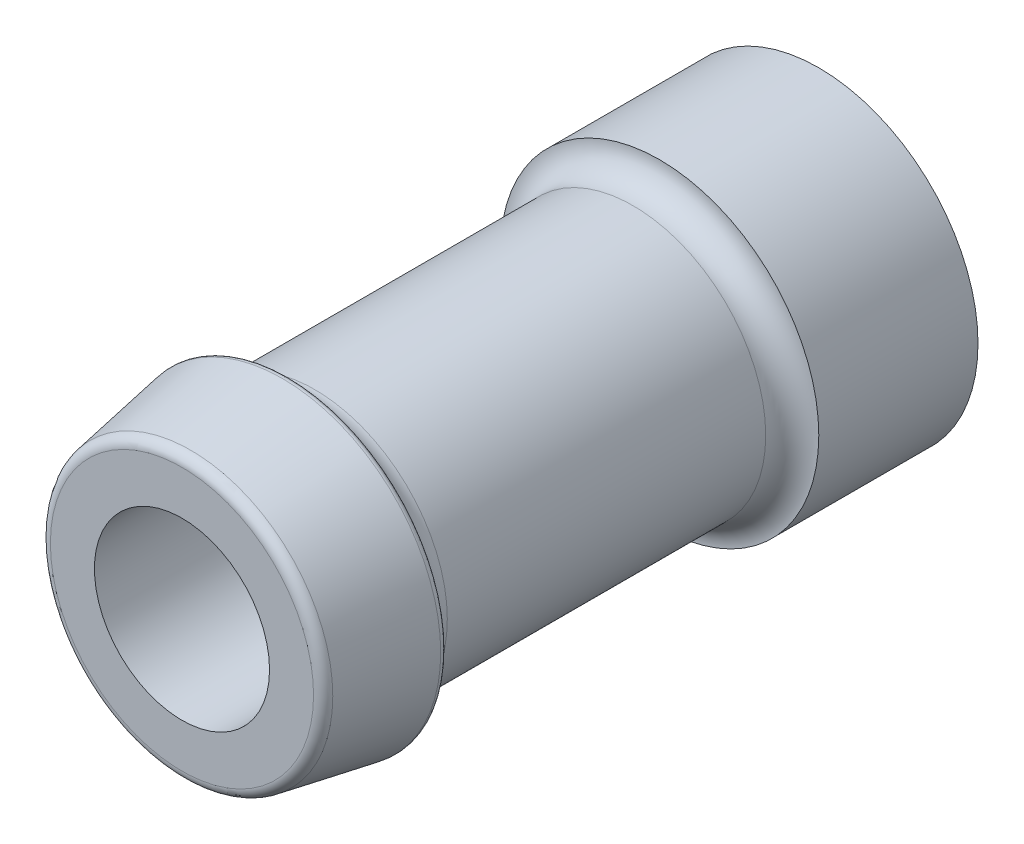
ISO-10303-21;
HEADER;
FILE_DESCRIPTION(('STEP AP214'),'2;1');
FILE_NAME('part.step','',(''),(''),'','','');
FILE_SCHEMA(('AUTOMOTIVE_DESIGN { 1 0 10303 214 1 1 1 1 }'));
ENDSEC;
DATA;
#1=APPLICATION_CONTEXT('core data for automotive mechanical design processes');
#2=APPLICATION_PROTOCOL_DEFINITION('international standard','automotive_design',2000,#1);
#3=PRODUCT_CONTEXT('',#1,'mechanical');
#4=PRODUCT('Part','Part','',(#3));
#5=PRODUCT_RELATED_PRODUCT_CATEGORY('part','',(#4));
#6=PRODUCT_DEFINITION_FORMATION('','',#4);
#7=PRODUCT_DEFINITION_CONTEXT('part definition',#1,'design');
#8=PRODUCT_DEFINITION('design','',#6,#7);
#9=PRODUCT_DEFINITION_SHAPE('','',#8);
#10=(LENGTH_UNIT() NAMED_UNIT(*) SI_UNIT(.MILLI.,.METRE.));
#11=(NAMED_UNIT(*) PLANE_ANGLE_UNIT() SI_UNIT($,.RADIAN.));
#12=(NAMED_UNIT(*) SI_UNIT($,.STERADIAN.) SOLID_ANGLE_UNIT());
#13=UNCERTAINTY_MEASURE_WITH_UNIT(LENGTH_MEASURE(1.E-05),#10,'distance_accuracy_value','');
#14=(GEOMETRIC_REPRESENTATION_CONTEXT(3) GLOBAL_UNCERTAINTY_ASSIGNED_CONTEXT((#13)) GLOBAL_UNIT_ASSIGNED_CONTEXT((#10,
#11,#12)) REPRESENTATION_CONTEXT('',''));
#15=CARTESIAN_POINT('',(0.,0.,0.));
#16=DIRECTION('',(0.,0.,1.));
#17=DIRECTION('',(1.,0.,0.));
#18=AXIS2_PLACEMENT_3D('',#15,#16,#17);
#19=CARTESIAN_POINT('',(0.,0.,30.48));
#20=DIRECTION('',(0.,0.,-1.));
#21=DIRECTION('',(-1.,0.,0.));
#22=AXIS2_PLACEMENT_3D('',#19,#20,#21);
#23=CYLINDRICAL_SURFACE('',#22,7.62);
#24=CARTESIAN_POINT('',(0.,0.,0.));
#25=DIRECTION('',(0.,0.,1.));
#26=DIRECTION('',(1.,0.,0.));
#27=AXIS2_PLACEMENT_3D('',#24,#25,#26);
#28=CIRCLE('',#27,7.62);
#29=CARTESIAN_POINT('',(-7.62,0.,0.));
#30=VERTEX_POINT('',#29);
#31=EDGE_CURVE('E71',#30,#30,#28,.T.);
#32=CARTESIAN_POINT('',(0.,0.,7.62));
#33=DIRECTION('',(0.,0.,1.));
#34=DIRECTION('',(1.,0.,0.));
#35=AXIS2_PLACEMENT_3D('',#32,#33,#34);
#36=CIRCLE('',#35,7.62);
#37=CARTESIAN_POINT('',(-7.62,0.,7.61999999999999));
#38=VERTEX_POINT('',#37);
#39=EDGE_CURVE('E72',#38,#38,#36,.T.);
#40=CARTESIAN_POINT('',(-7.62,0.,0.));
#41=CARTESIAN_POINT('',(-7.62,0.,0.0793749999999997));
#42=CARTESIAN_POINT('',(-7.62,0.,0.158749999999999));
#43=CARTESIAN_POINT('',(-7.62,0.,0.3175));
#44=CARTESIAN_POINT('',(-7.62,0.,0.396875));
#45=CARTESIAN_POINT('',(-7.62,0.,0.555625000000001));
#46=CARTESIAN_POINT('',(-7.62,0.,0.635));
#47=CARTESIAN_POINT('',(-7.62,0.,0.793749999999999));
#48=CARTESIAN_POINT('',(-7.62,0.,0.873124999999999));
#49=CARTESIAN_POINT('',(-7.62,0.,1.031875));
#50=CARTESIAN_POINT('',(-7.62,0.,1.11125));
#51=CARTESIAN_POINT('',(-7.62,0.,1.27));
#52=CARTESIAN_POINT('',(-7.62,0.,1.349375));
#53=CARTESIAN_POINT('',(-7.62,0.,1.508125));
#54=CARTESIAN_POINT('',(-7.62,0.,1.5875));
#55=CARTESIAN_POINT('',(-7.62,0.,1.74625));
#56=CARTESIAN_POINT('',(-7.62,0.,1.825625));
#57=CARTESIAN_POINT('',(-7.62,0.,1.984375));
#58=CARTESIAN_POINT('',(-7.62,0.,2.06375));
#59=CARTESIAN_POINT('',(-7.62,0.,2.2225));
#60=CARTESIAN_POINT('',(-7.62,0.,2.301875));
#61=CARTESIAN_POINT('',(-7.62,0.,2.460625));
#62=CARTESIAN_POINT('',(-7.62,0.,2.54));
#63=CARTESIAN_POINT('',(-7.62,0.,2.69875));
#64=CARTESIAN_POINT('',(-7.62,0.,2.778125));
#65=CARTESIAN_POINT('',(-7.62,0.,2.936875));
#66=CARTESIAN_POINT('',(-7.62,0.,3.01625));
#67=CARTESIAN_POINT('',(-7.62,0.,3.175));
#68=CARTESIAN_POINT('',(-7.62,0.,3.254375));
#69=CARTESIAN_POINT('',(-7.62,0.,3.413125));
#70=CARTESIAN_POINT('',(-7.62,0.,3.4925));
#71=CARTESIAN_POINT('',(-7.62,0.,3.65125));
#72=CARTESIAN_POINT('',(-7.62,0.,3.730625));
#73=CARTESIAN_POINT('',(-7.62,0.,3.889375));
#74=CARTESIAN_POINT('',(-7.62,0.,3.96875));
#75=CARTESIAN_POINT('',(-7.62,0.,4.1275));
#76=CARTESIAN_POINT('',(-7.62,0.,4.206875));
#77=CARTESIAN_POINT('',(-7.62,0.,4.365625));
#78=CARTESIAN_POINT('',(-7.62,0.,4.445));
#79=CARTESIAN_POINT('',(-7.62,0.,4.60375));
#80=CARTESIAN_POINT('',(-7.62,0.,4.683125));
#81=CARTESIAN_POINT('',(-7.62,0.,4.841875));
#82=CARTESIAN_POINT('',(-7.62,0.,4.92125));
#83=CARTESIAN_POINT('',(-7.62,0.,5.07999999999999));
#84=CARTESIAN_POINT('',(-7.62,0.,5.159375));
#85=CARTESIAN_POINT('',(-7.62,0.,5.318125));
#86=CARTESIAN_POINT('',(-7.62,0.,5.3975));
#87=CARTESIAN_POINT('',(-7.62,0.,5.55625));
#88=CARTESIAN_POINT('',(-7.62,0.,5.635625));
#89=CARTESIAN_POINT('',(-7.62,0.,5.794375));
#90=CARTESIAN_POINT('',(-7.62,0.,5.87375));
#91=CARTESIAN_POINT('',(-7.62,0.,6.0325));
#92=CARTESIAN_POINT('',(-7.62,0.,6.111875));
#93=CARTESIAN_POINT('',(-7.62,0.,6.27062499999999));
#94=CARTESIAN_POINT('',(-7.62,0.,6.34999999999999));
#95=CARTESIAN_POINT('',(-7.62,0.,6.50874999999999));
#96=CARTESIAN_POINT('',(-7.62,0.,6.588125));
#97=CARTESIAN_POINT('',(-7.62,0.,6.746875));
#98=CARTESIAN_POINT('',(-7.62,0.,6.82625));
#99=CARTESIAN_POINT('',(-7.62,0.,6.985));
#100=CARTESIAN_POINT('',(-7.62,0.,7.064375));
#101=CARTESIAN_POINT('',(-7.62,0.,7.223125));
#102=CARTESIAN_POINT('',(-7.62,0.,7.3025));
#103=CARTESIAN_POINT('',(-7.62,0.,7.46125));
#104=CARTESIAN_POINT('',(-7.62,0.,7.540625));
#105=CARTESIAN_POINT('',(-7.62,0.,7.61999999999999));
#106=B_SPLINE_CURVE_WITH_KNOTS('',3,(#40,#41,#42,#43,#44,#45,#46,#47,#48,#49,#50,#51,#52,#53,
#54,#55,#56,#57,#58,#59,#60,#61,#62,#63,#64,#65,#66,#67,#68,#69,#70,#71,#72,#73,#74,#75,#76,#77,
#78,#79,#80,#81,#82,#83,#84,#85,#86,#87,#88,#89,#90,#91,#92,#93,#94,#95,#96,#97,#98,#99,#100,
#101,#102,#103,#104,#105),.UNSPECIFIED.,.F.,.F.,(4,2,2,2,2,2,2,2,2,2,2,2,2,2,2,2,2,2,2,2,2,2,2,
2,2,2,2,2,2,2,2,2,4),(0.,0.238124999999999,0.476250000000001,0.714375,0.952499999999998,
1.190625,1.42875,1.666875,1.905,2.143125,2.38125,2.619375,2.8575,3.095625,3.33375,3.571875,3.81,
4.048125,4.28625,4.524375,4.7625,5.00062499999999,5.23875,5.476875,5.715,5.953125,6.19125,
6.42937499999999,6.6675,6.905625,7.14375,7.381875,7.61999999999999),.UNSPECIFIED.);
#107=EDGE_CURVE('BSEAM39',#30,#38,#106,.T.);
#108=ORIENTED_EDGE('',*,*,#31,.T.);
#109=ORIENTED_EDGE('',*,*,#39,.F.);
#110=ORIENTED_EDGE('',*,*,#107,.T.);
#111=ORIENTED_EDGE('',*,*,#107,.F.);
#112=EDGE_LOOP('',(#108,#110,#109,#111));
#113=FACE_BOUND('',#112,.T.);
#114=ADVANCED_FACE('F39',(#113),#23,.T.);
#115=CARTESIAN_POINT('',(0.,0.,30.48));
#116=DIRECTION('',(0.,0.,1.));
#117=DIRECTION('',(1.,0.,0.));
#118=AXIS2_PLACEMENT_3D('',#115,#116,#117);
#119=PLANE('',#118);
#120=CARTESIAN_POINT('',(0.,0.,30.48));
#121=DIRECTION('',(0.,0.,1.));
#122=DIRECTION('',(1.,0.,0.));
#123=AXIS2_PLACEMENT_3D('',#120,#121,#122);
#124=CIRCLE('',#123,6.29799632536296);
#125=CARTESIAN_POINT('',(6.29799632536296,0.,30.48));
#126=VERTEX_POINT('',#125);
#127=EDGE_CURVE('E57',#126,#126,#124,.T.);
#128=ORIENTED_EDGE('',*,*,#127,.T.);
#129=EDGE_LOOP('',(#128));
#130=FACE_BOUND('',#129,.T.);
#131=CARTESIAN_POINT('',(0.,0.,30.48));
#132=DIRECTION('',(0.,0.,1.));
#133=DIRECTION('',(1.,0.,0.));
#134=AXIS2_PLACEMENT_3D('',#131,#132,#133);
#135=CIRCLE('',#134,4.191);
#136=CARTESIAN_POINT('',(4.191,0.,30.48));
#137=VERTEX_POINT('',#136);
#138=EDGE_CURVE('E76',#137,#137,#135,.T.);
#139=ORIENTED_EDGE('',*,*,#138,.F.);
#140=EDGE_LOOP('',(#139));
#141=FACE_BOUND('',#140,.T.);
#142=ADVANCED_FACE('F98',(#130,#141),#119,.T.);
#143=CARTESIAN_POINT('',(0.,0.,0.));
#144=DIRECTION('',(0.,0.,1.));
#145=DIRECTION('',(1.,0.,0.));
#146=AXIS2_PLACEMENT_3D('',#143,#144,#145);
#147=PLANE('',#146);
#148=CARTESIAN_POINT('',(0.,0.,0.));
#149=DIRECTION('',(0.,0.,1.));
#150=DIRECTION('',(1.,0.,0.));
#151=AXIS2_PLACEMENT_3D('',#148,#149,#150);
#152=CIRCLE('',#151,4.191);
#153=CARTESIAN_POINT('',(4.191,0.,0.));
#154=VERTEX_POINT('',#153);
#155=EDGE_CURVE('E80',#154,#154,#152,.T.);
#156=ORIENTED_EDGE('',*,*,#155,.T.);
#157=EDGE_LOOP('',(#156));
#158=FACE_BOUND('',#157,.T.);
#159=ORIENTED_EDGE('',*,*,#31,.F.);
#160=EDGE_LOOP('',(#159));
#161=FACE_BOUND('',#160,.T.);
#162=ADVANCED_FACE('F88',(#158,#161),#147,.F.);
#163=CARTESIAN_POINT('',(0.,0.,0.));
#164=DIRECTION('',(0.,0.,1.));
#165=DIRECTION('',(1.,0.,0.));
#166=AXIS2_PLACEMENT_3D('',#163,#164,#165);
#167=CYLINDRICAL_SURFACE('',#166,4.191);
#168=CARTESIAN_POINT('',(4.191,0.,0.));
#169=CARTESIAN_POINT('',(4.191,0.,0.317499999999999));
#170=CARTESIAN_POINT('',(4.191,0.,0.635));
#171=CARTESIAN_POINT('',(4.191,0.,1.27));
#172=CARTESIAN_POINT('',(4.191,0.,1.5875));
#173=CARTESIAN_POINT('',(4.191,0.,2.2225));
#174=CARTESIAN_POINT('',(4.191,0.,2.54));
#175=CARTESIAN_POINT('',(4.191,0.,3.175));
#176=CARTESIAN_POINT('',(4.191,0.,3.4925));
#177=CARTESIAN_POINT('',(4.191,0.,4.1275));
#178=CARTESIAN_POINT('',(4.191,0.,4.445));
#179=CARTESIAN_POINT('',(4.191,0.,5.08));
#180=CARTESIAN_POINT('',(4.191,0.,5.3975));
#181=CARTESIAN_POINT('',(4.191,0.,6.0325));
#182=CARTESIAN_POINT('',(4.191,0.,6.35));
#183=CARTESIAN_POINT('',(4.191,0.,6.985));
#184=CARTESIAN_POINT('',(4.191,0.,7.3025));
#185=CARTESIAN_POINT('',(4.191,0.,7.9375));
#186=CARTESIAN_POINT('',(4.191,0.,8.255));
#187=CARTESIAN_POINT('',(4.191,0.,8.89));
#188=CARTESIAN_POINT('',(4.191,0.,9.2075));
#189=CARTESIAN_POINT('',(4.191,0.,9.8425));
#190=CARTESIAN_POINT('',(4.191,0.,10.16));
#191=CARTESIAN_POINT('',(4.191,0.,10.795));
#192=CARTESIAN_POINT('',(4.191,0.,11.1125));
#193=CARTESIAN_POINT('',(4.191,0.,11.7475));
#194=CARTESIAN_POINT('',(4.191,0.,12.065));
#195=CARTESIAN_POINT('',(4.191,0.,12.7));
#196=CARTESIAN_POINT('',(4.191,0.,13.0175));
#197=CARTESIAN_POINT('',(4.191,0.,13.6525));
#198=CARTESIAN_POINT('',(4.191,0.,13.97));
#199=CARTESIAN_POINT('',(4.191,0.,14.605));
#200=CARTESIAN_POINT('',(4.191,0.,14.9225));
#201=CARTESIAN_POINT('',(4.191,0.,15.5575));
#202=CARTESIAN_POINT('',(4.191,0.,15.875));
#203=CARTESIAN_POINT('',(4.191,0.,16.51));
#204=CARTESIAN_POINT('',(4.191,0.,16.8275));
#205=CARTESIAN_POINT('',(4.191,0.,17.4625));
#206=CARTESIAN_POINT('',(4.191,0.,17.78));
#207=CARTESIAN_POINT('',(4.191,0.,18.415));
#208=CARTESIAN_POINT('',(4.191,0.,18.7325));
#209=CARTESIAN_POINT('',(4.191,0.,19.3675));
#210=CARTESIAN_POINT('',(4.191,0.,19.685));
#211=CARTESIAN_POINT('',(4.191,0.,20.32));
#212=CARTESIAN_POINT('',(4.191,0.,20.6375));
#213=CARTESIAN_POINT('',(4.191,0.,21.2725));
#214=CARTESIAN_POINT('',(4.191,0.,21.59));
#215=CARTESIAN_POINT('',(4.191,0.,22.225));
#216=CARTESIAN_POINT('',(4.191,0.,22.5425));
#217=CARTESIAN_POINT('',(4.191,0.,23.1775));
#218=CARTESIAN_POINT('',(4.191,0.,23.495));
#219=CARTESIAN_POINT('',(4.191,0.,24.13));
#220=CARTESIAN_POINT('',(4.191,0.,24.4475));
#221=CARTESIAN_POINT('',(4.191,0.,25.0825));
#222=CARTESIAN_POINT('',(4.191,0.,25.4));
#223=CARTESIAN_POINT('',(4.191,0.,26.035));
#224=CARTESIAN_POINT('',(4.191,0.,26.3525));
#225=CARTESIAN_POINT('',(4.191,0.,26.9875));
#226=CARTESIAN_POINT('',(4.191,0.,27.305));
#227=CARTESIAN_POINT('',(4.191,0.,27.94));
#228=CARTESIAN_POINT('',(4.191,0.,28.2575));
#229=CARTESIAN_POINT('',(4.191,0.,28.8925));
#230=CARTESIAN_POINT('',(4.191,0.,29.21));
#231=CARTESIAN_POINT('',(4.191,0.,29.845));
#232=CARTESIAN_POINT('',(4.191,0.,30.1625));
#233=CARTESIAN_POINT('',(4.191,0.,30.48));
#234=B_SPLINE_CURVE_WITH_KNOTS('',3,(#168,#169,#170,#171,#172,#173,#174,#175,#176,#177,#178,
#179,#180,#181,#182,#183,#184,#185,#186,#187,#188,#189,#190,#191,#192,#193,#194,#195,#196,#197,
#198,#199,#200,#201,#202,#203,#204,#205,#206,#207,#208,#209,#210,#211,#212,#213,#214,#215,#216,
#217,#218,#219,#220,#221,#222,#223,#224,#225,#226,#227,#228,#229,#230,#231,#232,#233),
.UNSPECIFIED.,.F.,.F.,(4,2,2,2,2,2,2,2,2,2,2,2,2,2,2,2,2,2,2,2,2,2,2,2,2,2,2,2,2,2,2,2,4),(0.,
0.9525,1.905,2.8575,3.81,4.7625,5.715,6.6675,7.62,8.5725,9.525,10.4775,11.43,12.3825,13.335,
14.2875,15.24,16.1925,17.145,18.0975,19.05,20.0025,20.955,21.9075,22.86,23.8125,24.765,25.7175,
26.67,27.6225,28.575,29.5275,30.48),.UNSPECIFIED.);
#235=EDGE_CURVE('BSEAM91',#154,#137,#234,.T.);
#236=ORIENTED_EDGE('',*,*,#155,.F.);
#237=ORIENTED_EDGE('',*,*,#138,.T.);
#238=ORIENTED_EDGE('',*,*,#235,.T.);
#239=ORIENTED_EDGE('',*,*,#235,.F.);
#240=EDGE_LOOP('',(#236,#238,#237,#239));
#241=FACE_BOUND('',#240,.T.);
#242=ADVANCED_FACE('F91',(#241),#167,.F.);
#243=CARTESIAN_POINT('',(0.,0.,7.62));
#244=DIRECTION('',(0.,0.,1.));
#245=DIRECTION('',(1.,0.,0.));
#246=AXIS2_PLACEMENT_3D('',#243,#244,#245);
#247=CYLINDRICAL_SURFACE('',#246,6.35);
#248=CARTESIAN_POINT('',(0.,0.,24.13));
#249=DIRECTION('',(0.,0.,1.));
#250=DIRECTION('',(1.,0.,0.));
#251=AXIS2_PLACEMENT_3D('',#248,#249,#250);
#252=CIRCLE('',#251,6.35);
#253=CARTESIAN_POINT('',(6.35,0.,24.13));
#254=VERTEX_POINT('',#253);
#255=EDGE_CURVE('E63',#254,#254,#252,.F.);
#256=ORIENTED_EDGE('',*,*,#255,.T.);
#257=EDGE_LOOP('',(#256));
#258=FACE_BOUND('',#257,.T.);
#259=CARTESIAN_POINT('',(0.,0.,8.89));
#260=DIRECTION('',(0.,0.,1.));
#261=DIRECTION('',(1.,0.,0.));
#262=AXIS2_PLACEMENT_3D('',#259,#260,#261);
#263=CIRCLE('',#262,6.35);
#264=CARTESIAN_POINT('',(6.35,0.,8.89));
#265=VERTEX_POINT('',#264);
#266=EDGE_CURVE('E67',#265,#265,#263,.T.);
#267=ORIENTED_EDGE('',*,*,#266,.T.);
#268=EDGE_LOOP('',(#267));
#269=FACE_BOUND('',#268,.T.);
#270=ADVANCED_FACE('F94',(#258,#269),#247,.T.);
#271=CARTESIAN_POINT('',(0.,0.,8.89));
#272=DIRECTION('',(0.,0.,1.));
#273=DIRECTION('',(1.,0.,0.));
#274=AXIS2_PLACEMENT_3D('',#271,#272,#273);
#275=TOROIDAL_SURFACE('',#274,7.62,1.27);
#276=ORIENTED_EDGE('',*,*,#39,.T.);
#277=EDGE_LOOP('',(#276));
#278=FACE_BOUND('',#277,.T.);
#279=ORIENTED_EDGE('',*,*,#266,.F.);
#280=EDGE_LOOP('',(#279));
#281=FACE_BOUND('',#280,.T.);
#282=ADVANCED_FACE('F111',(#278,#281),#275,.F.);
#283=CARTESIAN_POINT('',(0.,0.,24.13));
#284=DIRECTION('',(0.,0.,1.));
#285=DIRECTION('',(1.,0.,0.));
#286=AXIS2_PLACEMENT_3D('',#283,#284,#285);
#287=TOROIDAL_SURFACE('',#286,7.62,1.27);
#288=CARTESIAN_POINT('',(0.,0.,25.3755613667271));
#289=DIRECTION('',(0.,0.,-1.));
#290=DIRECTION('',(-1.,0.,0.));
#291=AXIS2_PLACEMENT_3D('',#288,#289,#290);
#292=CIRCLE('',#291,7.37205467998522);
#293=CARTESIAN_POINT('',(-7.37205467998522,0.,25.3755613667271));
#294=VERTEX_POINT('',#293);
#295=EDGE_CURVE('E10',#294,#294,#292,.T.);
#296=ORIENTED_EDGE('',*,*,#295,.T.);
#297=EDGE_LOOP('',(#296));
#298=FACE_BOUND('',#297,.T.);
#299=ORIENTED_EDGE('',*,*,#255,.F.);
#300=EDGE_LOOP('',(#299));
#301=FACE_BOUND('',#300,.T.);
#302=ADVANCED_FACE('F114',(#298,#301),#287,.F.);
#303=CARTESIAN_POINT('',(0.,0.,30.48));
#304=DIRECTION('',(0.,0.,-1.));
#305=DIRECTION('',(-1.,0.,0.));
#306=AXIS2_PLACEMENT_3D('',#303,#304,#305);
#307=CONICAL_SURFACE('',#306,6.72425893800102,0.17453292519943);
#308=CARTESIAN_POINT('',(0.,0.,25.6687802771998));
#309=DIRECTION('',(0.,0.,-1.));
#310=DIRECTION('',(-1.,0.,0.));
#311=AXIS2_PLACEMENT_3D('',#308,#309,#310);
#312=CIRCLE('',#311,7.57260678524739);
#313=CARTESIAN_POINT('',(-7.57260678524739,0.,25.6687802771998));
#314=VERTEX_POINT('',#313);
#315=EDGE_CURVE('E47',#314,#314,#312,.F.);
#316=ORIENTED_EDGE('',*,*,#315,.T.);
#317=EDGE_LOOP('',(#316));
#318=FACE_BOUND('',#317,.T.);
#319=CARTESIAN_POINT('',(0.,0.,30.0602132742548));
#320=DIRECTION('',(0.,0.,1.));
#321=DIRECTION('',(1.,0.,0.));
#322=AXIS2_PLACEMENT_3D('',#319,#320,#321);
#323=CIRCLE('',#322,6.79827866389316);
#324=CARTESIAN_POINT('',(6.79827866389316,0.,30.0602132742548));
#325=VERTEX_POINT('',#324);
#326=EDGE_CURVE('E52',#325,#325,#323,.F.);
#327=ORIENTED_EDGE('',*,*,#326,.T.);
#328=EDGE_LOOP('',(#327));
#329=FACE_BOUND('',#328,.T.);
#330=ADVANCED_FACE('F118',(#318,#329),#307,.T.);
#331=CARTESIAN_POINT('',(0.,0.,29.972));
#332=DIRECTION('',(0.,0.,1.));
#333=DIRECTION('',(1.,0.,0.));
#334=AXIS2_PLACEMENT_3D('',#331,#332,#333);
#335=TOROIDAL_SURFACE('',#334,6.29799632536296,0.508);
#336=ORIENTED_EDGE('',*,*,#326,.F.);
#337=EDGE_LOOP('',(#336));
#338=FACE_BOUND('',#337,.T.);
#339=ORIENTED_EDGE('',*,*,#127,.F.);
#340=EDGE_LOOP('',(#339));
#341=FACE_BOUND('',#340,.T.);
#342=ADVANCED_FACE('F123',(#338,#341),#335,.T.);
#343=CARTESIAN_POINT('',(0.,0.,25.6246736400724));
#344=DIRECTION('',(0.,0.,-1.));
#345=DIRECTION('',(-1.,0.,0.));
#346=AXIS2_PLACEMENT_3D('',#343,#344,#345);
#347=TOROIDAL_SURFACE('',#346,7.32246561598228,0.254);
#348=ORIENTED_EDGE('',*,*,#295,.F.);
#349=EDGE_LOOP('',(#348));
#350=FACE_BOUND('',#349,.T.);
#351=ORIENTED_EDGE('',*,*,#315,.F.);
#352=EDGE_LOOP('',(#351));
#353=FACE_BOUND('',#352,.T.);
#354=ADVANCED_FACE('F41',(#350,#353),#347,.T.);
#355=CLOSED_SHELL('',(#114,#142,#162,#242,#270,#282,#302,#330,#342,#354));
#356=MANIFOLD_SOLID_BREP('B2',#355);
#357=ADVANCED_BREP_SHAPE_REPRESENTATION('',(#18,#356),#14);
#358=SHAPE_DEFINITION_REPRESENTATION(#9,#357);
ENDSEC;
END-ISO-10303-21;
